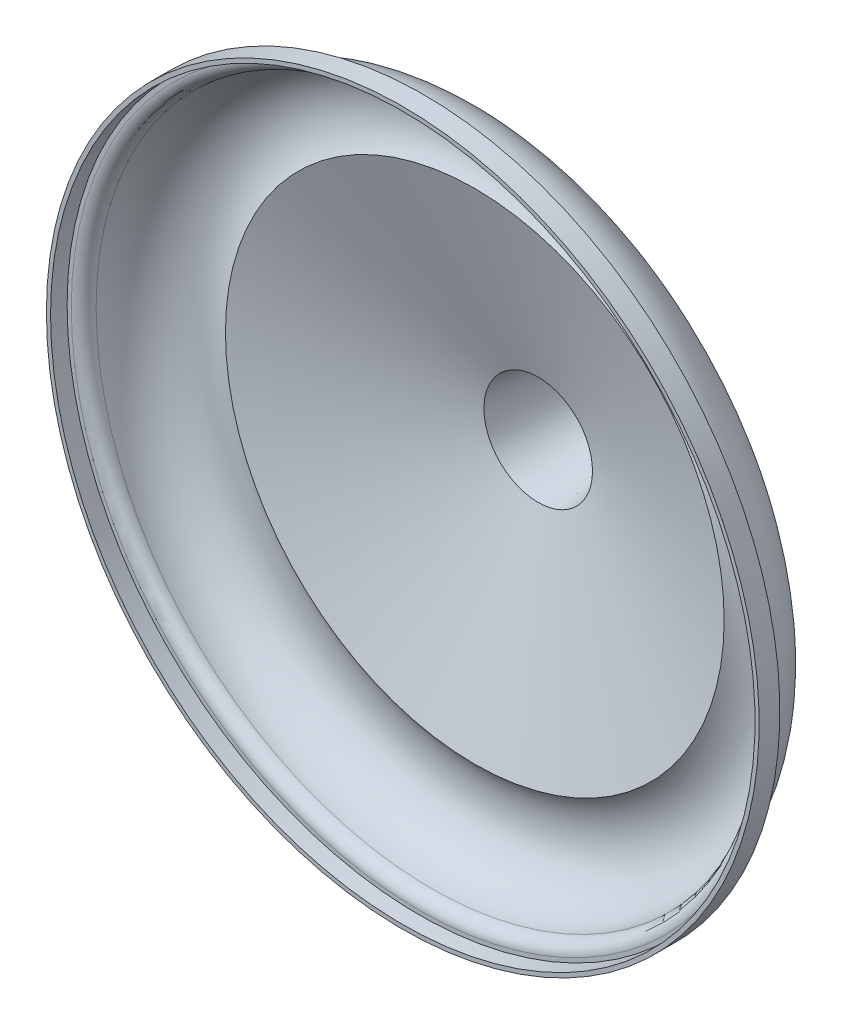
ISO-10303-21;
HEADER;
FILE_DESCRIPTION(('STEP AP214'),'2;1');
FILE_NAME('part.step','',(''),(''),'','','');
FILE_SCHEMA(('AUTOMOTIVE_DESIGN { 1 0 10303 214 1 1 1 1 }'));
ENDSEC;
DATA;
#1=APPLICATION_CONTEXT('core data for automotive mechanical design processes');
#2=APPLICATION_PROTOCOL_DEFINITION('international standard','automotive_design',2000,#1);
#3=PRODUCT_CONTEXT('',#1,'mechanical');
#4=PRODUCT('Part','Part','',(#3));
#5=PRODUCT_RELATED_PRODUCT_CATEGORY('part','',(#4));
#6=PRODUCT_DEFINITION_FORMATION('','',#4);
#7=PRODUCT_DEFINITION_CONTEXT('part definition',#1,'design');
#8=PRODUCT_DEFINITION('design','',#6,#7);
#9=PRODUCT_DEFINITION_SHAPE('','',#8);
#10=(LENGTH_UNIT() NAMED_UNIT(*) SI_UNIT(.MILLI.,.METRE.));
#11=(NAMED_UNIT(*) PLANE_ANGLE_UNIT() SI_UNIT($,.RADIAN.));
#12=(NAMED_UNIT(*) SI_UNIT($,.STERADIAN.) SOLID_ANGLE_UNIT());
#13=UNCERTAINTY_MEASURE_WITH_UNIT(LENGTH_MEASURE(1.E-05),#10,'distance_accuracy_value','');
#14=(GEOMETRIC_REPRESENTATION_CONTEXT(3) GLOBAL_UNCERTAINTY_ASSIGNED_CONTEXT((#13)) GLOBAL_UNIT_ASSIGNED_CONTEXT((#10,
#11,#12)) REPRESENTATION_CONTEXT('',''));
#15=CARTESIAN_POINT('',(0.,0.,0.));
#16=DIRECTION('',(0.,0.,1.));
#17=DIRECTION('',(1.,0.,0.));
#18=AXIS2_PLACEMENT_3D('',#15,#16,#17);
#19=CARTESIAN_POINT('',(43.,0.,0.));
#20=DIRECTION('',(0.,0.,-1.));
#21=DIRECTION('',(-1.,0.,0.));
#22=AXIS2_PLACEMENT_3D('',#19,#20,#21);
#23=PLANE('',#22);
#24=CARTESIAN_POINT('',(0.,0.,0.));
#25=DIRECTION('',(0.,0.,-1.));
#26=DIRECTION('',(-1.,0.,0.));
#27=AXIS2_PLACEMENT_3D('',#24,#25,#26);
#28=CIRCLE('',#27,42.5);
#29=CARTESIAN_POINT('',(-42.5,0.,0.));
#30=VERTEX_POINT('',#29);
#31=EDGE_CURVE('E58',#30,#30,#28,.T.);
#32=ORIENTED_EDGE('',*,*,#31,.T.);
#33=EDGE_LOOP('',(#32));
#34=FACE_BOUND('',#33,.T.);
#35=CARTESIAN_POINT('',(0.,0.,0.));
#36=DIRECTION('',(0.,0.,-1.));
#37=DIRECTION('',(-1.,0.,0.));
#38=AXIS2_PLACEMENT_3D('',#35,#36,#37);
#39=CIRCLE('',#38,43.);
#40=CARTESIAN_POINT('',(-43.,0.,0.));
#41=VERTEX_POINT('',#40);
#42=EDGE_CURVE('E10',#41,#41,#39,.T.);
#43=ORIENTED_EDGE('',*,*,#42,.F.);
#44=EDGE_LOOP('',(#43));
#45=FACE_BOUND('',#44,.T.);
#46=ADVANCED_FACE('F30',(#34,#45),#23,.F.);
#47=CARTESIAN_POINT('',(0.,0.,-30.));
#48=DIRECTION('',(0.,0.,-1.));
#49=DIRECTION('',(-1.,0.,0.));
#50=AXIS2_PLACEMENT_3D('',#47,#48,#49);
#51=CYLINDRICAL_SURFACE('',#50,43.);
#52=CARTESIAN_POINT('',(0.,0.,-2.5));
#53=DIRECTION('',(0.,0.,-1.));
#54=DIRECTION('',(-1.,0.,0.));
#55=AXIS2_PLACEMENT_3D('',#52,#53,#54);
#56=CIRCLE('',#55,43.);
#57=CARTESIAN_POINT('',(-43.,0.,-2.5));
#58=VERTEX_POINT('',#57);
#59=EDGE_CURVE('E36',#58,#58,#56,.T.);
#60=ORIENTED_EDGE('',*,*,#59,.F.);
#61=EDGE_LOOP('',(#60));
#62=FACE_BOUND('',#61,.T.);
#63=ORIENTED_EDGE('',*,*,#42,.T.);
#64=EDGE_LOOP('',(#63));
#65=FACE_BOUND('',#64,.T.);
#66=ADVANCED_FACE('F98',(#62,#65),#51,.T.);
#67=CARTESIAN_POINT('',(43.,0.,-2.5));
#68=DIRECTION('',(0.,0.,1.));
#69=DIRECTION('',(1.,0.,0.));
#70=AXIS2_PLACEMENT_3D('',#67,#68,#69);
#71=PLANE('',#70);
#72=CARTESIAN_POINT('',(0.,0.,-2.50000000000001));
#73=DIRECTION('',(0.,0.,-1.));
#74=DIRECTION('',(-1.,0.,0.));
#75=AXIS2_PLACEMENT_3D('',#72,#73,#74);
#76=CIRCLE('',#75,42.);
#77=CARTESIAN_POINT('',(-42.,0.,-2.50000000000001));
#78=VERTEX_POINT('',#77);
#79=EDGE_CURVE('E40',#78,#78,#76,.T.);
#80=ORIENTED_EDGE('',*,*,#79,.F.);
#81=EDGE_LOOP('',(#80));
#82=FACE_BOUND('',#81,.T.);
#83=ORIENTED_EDGE('',*,*,#59,.T.);
#84=EDGE_LOOP('',(#83));
#85=FACE_BOUND('',#84,.T.);
#86=ADVANCED_FACE('F103',(#82,#85),#71,.F.);
#87=CARTESIAN_POINT('',(0.,0.,-3.5));
#88=DIRECTION('',(0.,0.,-1.));
#89=DIRECTION('',(-1.,0.,0.));
#90=AXIS2_PLACEMENT_3D('',#87,#88,#89);
#91=TOROIDAL_SURFACE('',#90,42.,0.999999999999997);
#92=CARTESIAN_POINT('',(0.,0.,-3.50000000000001));
#93=DIRECTION('',(0.,0.,-1.));
#94=DIRECTION('',(-1.,0.,0.));
#95=AXIS2_PLACEMENT_3D('',#92,#93,#94);
#96=CIRCLE('',#95,41.);
#97=CARTESIAN_POINT('',(-41.,0.,-3.50000000000001));
#98=VERTEX_POINT('',#97);
#99=EDGE_CURVE('E44',#98,#98,#96,.T.);
#100=ORIENTED_EDGE('',*,*,#99,.F.);
#101=EDGE_LOOP('',(#100));
#102=FACE_BOUND('',#101,.T.);
#103=ORIENTED_EDGE('',*,*,#79,.T.);
#104=EDGE_LOOP('',(#103));
#105=FACE_BOUND('',#104,.T.);
#106=ADVANCED_FACE('F110',(#102,#105),#91,.F.);
#107=CARTESIAN_POINT('',(0.,0.,-3.5));
#108=DIRECTION('',(0.,0.,-1.));
#109=DIRECTION('',(-1.,0.,0.));
#110=AXIS2_PLACEMENT_3D('',#107,#108,#109);
#111=TOROIDAL_SURFACE('',#110,34.,7.);
#112=CARTESIAN_POINT('',(0.,0.,-9.244562646538));
#113=DIRECTION('',(0.,0.,-1.));
#114=DIRECTION('',(-1.,0.,0.));
#115=AXIS2_PLACEMENT_3D('',#112,#113,#114);
#116=CIRCLE('',#115,30.);
#117=CARTESIAN_POINT('',(30.,0.,-9.244562646538));
#118=VERTEX_POINT('',#117);
#119=EDGE_CURVE('E49',#118,#118,#116,.T.);
#120=ORIENTED_EDGE('',*,*,#119,.F.);
#121=EDGE_LOOP('',(#120));
#122=FACE_BOUND('',#121,.T.);
#123=ORIENTED_EDGE('',*,*,#99,.T.);
#124=EDGE_LOOP('',(#123));
#125=FACE_BOUND('',#124,.T.);
#126=ADVANCED_FACE('F116',(#122,#125),#111,.T.);
#127=CARTESIAN_POINT('',(0.,0.,-9.244562646538));
#128=DIRECTION('',(0.,0.,1.));
#129=DIRECTION('',(1.,0.,0.));
#130=AXIS2_PLACEMENT_3D('',#127,#128,#129);
#131=CONICAL_SURFACE('',#130,30.,1.25663706143592);
#132=CARTESIAN_POINT('',(0.,0.,-16.7177156598947));
#133=DIRECTION('',(0.,0.,-1.));
#134=DIRECTION('',(-1.,0.,0.));
#135=AXIS2_PLACEMENT_3D('',#132,#133,#134);
#136=CIRCLE('',#135,6.99999999999992);
#137=CARTESIAN_POINT('',(6.99999999999993,0.,-16.7177156598947));
#138=VERTEX_POINT('',#137);
#139=EDGE_CURVE('E52',#138,#138,#136,.T.);
#140=CARTESIAN_POINT('',(6.99999999999993,0.,-16.7177156598947));
#141=CARTESIAN_POINT('',(7.23958333333326,0.,-16.6398703160056));
#142=CARTESIAN_POINT('',(7.47916666666659,0.,-16.5620249721164));
#143=CARTESIAN_POINT('',(7.95833333333326,0.,-16.4063342843382));
#144=CARTESIAN_POINT('',(8.1979166666666,0.,-16.328488940449));
#145=CARTESIAN_POINT('',(8.67708333333326,0.,-16.1727982526708));
#146=CARTESIAN_POINT('',(8.9166666666666,0.,-16.0949529087817));
#147=CARTESIAN_POINT('',(9.39583333333327,0.,-15.9392622210034));
#148=CARTESIAN_POINT('',(9.6354166666666,0.,-15.8614168771143));
#149=CARTESIAN_POINT('',(10.1145833333333,0.,-15.705726189336));
#150=CARTESIAN_POINT('',(10.3541666666666,0.,-15.6278808454469));
#151=CARTESIAN_POINT('',(10.8333333333333,0.,-15.4721901576686));
#152=CARTESIAN_POINT('',(11.0729166666666,0.,-15.3943448137795));
#153=CARTESIAN_POINT('',(11.5520833333333,0.,-15.2386541260012));
#154=CARTESIAN_POINT('',(11.7916666666666,0.,-15.1608087821121));
#155=CARTESIAN_POINT('',(12.2708333333333,0.,-15.0051180943338));
#156=CARTESIAN_POINT('',(12.5104166666666,0.,-14.9272727504447));
#157=CARTESIAN_POINT('',(12.9895833333333,0.,-14.7715820626664));
#158=CARTESIAN_POINT('',(13.2291666666666,0.,-14.6937367187773));
#159=CARTESIAN_POINT('',(13.7083333333333,0.,-14.538046030999));
#160=CARTESIAN_POINT('',(13.9479166666666,0.,-14.4602006871099));
#161=CARTESIAN_POINT('',(14.4270833333333,0.,-14.3045099993316));
#162=CARTESIAN_POINT('',(14.6666666666666,0.,-14.2266646554425));
#163=CARTESIAN_POINT('',(15.1458333333333,0.,-14.0709739676642));
#164=CARTESIAN_POINT('',(15.3854166666666,0.,-13.9931286237751));
#165=CARTESIAN_POINT('',(15.8645833333333,0.,-13.8374379359968));
#166=CARTESIAN_POINT('',(16.1041666666666,0.,-13.7595925921077));
#167=CARTESIAN_POINT('',(16.5833333333333,0.,-13.6039019043294));
#168=CARTESIAN_POINT('',(16.8229166666666,0.,-13.5260565604403));
#169=CARTESIAN_POINT('',(17.3020833333333,0.,-13.370365872662));
#170=CARTESIAN_POINT('',(17.5416666666666,0.,-13.2925205287729));
#171=CARTESIAN_POINT('',(18.0208333333333,0.,-13.1368298409946));
#172=CARTESIAN_POINT('',(18.2604166666666,0.,-13.0589844971055));
#173=CARTESIAN_POINT('',(18.7395833333333,0.,-12.9032938093272));
#174=CARTESIAN_POINT('',(18.9791666666666,0.,-12.8254484654381));
#175=CARTESIAN_POINT('',(19.4583333333333,0.,-12.6697577776598));
#176=CARTESIAN_POINT('',(19.6979166666666,0.,-12.5919124337707));
#177=CARTESIAN_POINT('',(20.1770833333333,0.,-12.4362217459924));
#178=CARTESIAN_POINT('',(20.4166666666666,0.,-12.3583764021033));
#179=CARTESIAN_POINT('',(20.8958333333333,0.,-12.202685714325));
#180=CARTESIAN_POINT('',(21.1354166666666,0.,-12.1248403704359));
#181=CARTESIAN_POINT('',(21.6145833333333,0.,-11.9691496826576));
#182=CARTESIAN_POINT('',(21.8541666666666,0.,-11.8913043387685));
#183=CARTESIAN_POINT('',(22.3333333333333,0.,-11.7356136509902));
#184=CARTESIAN_POINT('',(22.5729166666666,0.,-11.6577683071011));
#185=CARTESIAN_POINT('',(23.0520833333333,0.,-11.5020776193228));
#186=CARTESIAN_POINT('',(23.2916666666666,0.,-11.4242322754337));
#187=CARTESIAN_POINT('',(23.7708333333333,0.,-11.2685415876554));
#188=CARTESIAN_POINT('',(24.0104166666666,0.,-11.1906962437663));
#189=CARTESIAN_POINT('',(24.4895833333333,0.,-11.035005555988));
#190=CARTESIAN_POINT('',(24.7291666666667,0.,-10.9571602120989));
#191=CARTESIAN_POINT('',(25.2083333333333,0.,-10.8014695243206));
#192=CARTESIAN_POINT('',(25.4479166666667,0.,-10.7236241804315));
#193=CARTESIAN_POINT('',(25.9270833333333,0.,-10.5679334926532));
#194=CARTESIAN_POINT('',(26.1666666666667,0.,-10.4900881487641));
#195=CARTESIAN_POINT('',(26.6458333333333,0.,-10.3343974609859));
#196=CARTESIAN_POINT('',(26.8854166666667,0.,-10.2565521170967));
#197=CARTESIAN_POINT('',(27.3645833333333,0.,-10.1008614293185));
#198=CARTESIAN_POINT('',(27.6041666666667,0.,-10.0230160854293));
#199=CARTESIAN_POINT('',(28.0833333333333,0.,-9.86732539765106));
#200=CARTESIAN_POINT('',(28.3229166666667,0.,-9.78948005376193));
#201=CARTESIAN_POINT('',(28.8020833333333,0.,-9.63378936598366));
#202=CARTESIAN_POINT('',(29.0416666666667,0.,-9.55594402209453));
#203=CARTESIAN_POINT('',(29.5208333333333,0.,-9.40025333431627));
#204=CARTESIAN_POINT('',(29.7604166666667,0.,-9.32240799042713));
#205=CARTESIAN_POINT('',(30.,0.,-9.244562646538));
#206=B_SPLINE_CURVE_WITH_KNOTS('',3,(#140,#141,#142,#143,#144,#145,#146,#147,#148,#149,#150,
#151,#152,#153,#154,#155,#156,#157,#158,#159,#160,#161,#162,#163,#164,#165,#166,#167,#168,#169,
#170,#171,#172,#173,#174,#175,#176,#177,#178,#179,#180,#181,#182,#183,#184,#185,#186,#187,#188,
#189,#190,#191,#192,#193,#194,#195,#196,#197,#198,#199,#200,#201,#202,#203,#204,#205),
.UNSPECIFIED.,.F.,.F.,(4,2,2,2,2,2,2,2,2,2,2,2,2,2,2,2,2,2,2,2,2,2,2,2,2,2,2,2,2,2,2,2,4),(0.,
0.755738473671254,1.51147694734251,2.26721542101376,3.02295389468502,3.77869236835628,
4.53443084202753,5.29016931569879,6.04590778937004,6.8016462630413,7.55738473671255,
8.31312321038381,9.06886168405506,9.82460015772632,10.5803386313976,11.3360771050688,
12.0918155787401,12.8475540524113,13.6032925260826,14.3590309997539,15.1147694734251,
15.8705079470964,16.6262464207676,17.3819848944389,18.1377233681101,18.8934618417814,
19.6492003154526,20.4049387891239,21.1606772627952,21.9164157364664,22.6721542101377,
23.4278926838089,24.1836311574802),.UNSPECIFIED.);
#207=EDGE_CURVE('BSEAM120',#138,#118,#206,.T.);
#208=ORIENTED_EDGE('',*,*,#139,.F.);
#209=ORIENTED_EDGE('',*,*,#119,.T.);
#210=ORIENTED_EDGE('',*,*,#207,.T.);
#211=ORIENTED_EDGE('',*,*,#207,.F.);
#212=EDGE_LOOP('',(#208,#210,#209,#211));
#213=FACE_BOUND('',#212,.T.);
#214=ADVANCED_FACE('F120',(#213),#131,.T.);
#215=CARTESIAN_POINT('',(0.,0.,-16.7177156598947));
#216=DIRECTION('',(0.,0.,1.));
#217=DIRECTION('',(1.,0.,0.));
#218=AXIS2_PLACEMENT_3D('',#215,#216,#217);
#219=CONICAL_SURFACE('',#218,6.99999999999992,0.14569427150286);
#220=CARTESIAN_POINT('',(0.,0.,-29.3255659684264));
#221=DIRECTION('',(0.,0.,-1.));
#222=DIRECTION('',(-1.,0.,0.));
#223=AXIS2_PLACEMENT_3D('',#220,#221,#222);
#224=CIRCLE('',#223,5.15);
#225=CARTESIAN_POINT('',(-5.15,0.,-29.3255659684264));
#226=VERTEX_POINT('',#225);
#227=EDGE_CURVE('E55',#226,#226,#224,.T.);
#228=ORIENTED_EDGE('',*,*,#227,.F.);
#229=EDGE_LOOP('',(#228));
#230=FACE_BOUND('',#229,.T.);
#231=ORIENTED_EDGE('',*,*,#139,.T.);
#232=EDGE_LOOP('',(#231));
#233=FACE_BOUND('',#232,.T.);
#234=ADVANCED_FACE('F124',(#230,#233),#219,.T.);
#235=CARTESIAN_POINT('',(0.,0.,-10.));
#236=DIRECTION('',(0.,0.,-1.));
#237=DIRECTION('',(1.,0.,0.));
#238=AXIS2_PLACEMENT_3D('',#235,#236,#237);
#239=SPHERICAL_SURFACE('',#238,20.);
#240=ORIENTED_EDGE('',*,*,#227,.T.);
#241=EDGE_LOOP('',(#240));
#242=FACE_BOUND('',#241,.T.);
#243=ADVANCED_FACE('F95',(#242),#239,.T.);
#244=CARTESIAN_POINT('',(0.,0.,-30.));
#245=DIRECTION('',(0.,0.,-1.));
#246=DIRECTION('',(-1.,0.,0.));
#247=AXIS2_PLACEMENT_3D('',#244,#245,#246);
#248=CYLINDRICAL_SURFACE('',#247,42.5);
#249=CARTESIAN_POINT('',(0.,0.,-2.00000000000001));
#250=DIRECTION('',(0.,0.,1.));
#251=DIRECTION('',(1.,0.,0.));
#252=AXIS2_PLACEMENT_3D('',#249,#250,#251);
#253=CIRCLE('',#252,42.5);
#254=CARTESIAN_POINT('',(42.5,0.,-2.00000000000001));
#255=VERTEX_POINT('',#254);
#256=EDGE_CURVE('E61',#255,#255,#253,.F.);
#257=ORIENTED_EDGE('',*,*,#256,.T.);
#258=EDGE_LOOP('',(#257));
#259=FACE_BOUND('',#258,.T.);
#260=ORIENTED_EDGE('',*,*,#31,.F.);
#261=EDGE_LOOP('',(#260));
#262=FACE_BOUND('',#261,.T.);
#263=ADVANCED_FACE('F80',(#259,#262),#248,.F.);
#264=CARTESIAN_POINT('',(43.,0.,-2.));
#265=DIRECTION('',(0.,0.,1.));
#266=DIRECTION('',(1.,0.,0.));
#267=AXIS2_PLACEMENT_3D('',#264,#265,#266);
#268=PLANE('',#267);
#269=CARTESIAN_POINT('',(0.,0.,-2.00000000000001));
#270=DIRECTION('',(0.,0.,-1.));
#271=DIRECTION('',(-1.,0.,0.));
#272=AXIS2_PLACEMENT_3D('',#269,#270,#271);
#273=CIRCLE('',#272,42.);
#274=CARTESIAN_POINT('',(-42.,0.,-2.00000000000001));
#275=VERTEX_POINT('',#274);
#276=EDGE_CURVE('E74',#275,#275,#273,.T.);
#277=ORIENTED_EDGE('',*,*,#276,.T.);
#278=EDGE_LOOP('',(#277));
#279=FACE_BOUND('',#278,.T.);
#280=ORIENTED_EDGE('',*,*,#256,.F.);
#281=EDGE_LOOP('',(#280));
#282=FACE_BOUND('',#281,.T.);
#283=ADVANCED_FACE('F83',(#279,#282),#268,.T.);
#284=CARTESIAN_POINT('',(0.,0.,-3.5));
#285=DIRECTION('',(0.,0.,-1.));
#286=DIRECTION('',(-1.,0.,0.));
#287=AXIS2_PLACEMENT_3D('',#284,#285,#286);
#288=TOROIDAL_SURFACE('',#287,42.,1.5);
#289=CARTESIAN_POINT('',(0.,0.,-3.50000000000001));
#290=DIRECTION('',(0.,0.,-1.));
#291=DIRECTION('',(-1.,0.,0.));
#292=AXIS2_PLACEMENT_3D('',#289,#290,#291);
#293=CIRCLE('',#292,40.5);
#294=CARTESIAN_POINT('',(-40.5,0.,-3.50000000000001));
#295=VERTEX_POINT('',#294);
#296=EDGE_CURVE('E71',#295,#295,#293,.T.);
#297=ORIENTED_EDGE('',*,*,#296,.T.);
#298=EDGE_LOOP('',(#297));
#299=FACE_BOUND('',#298,.T.);
#300=ORIENTED_EDGE('',*,*,#276,.F.);
#301=EDGE_LOOP('',(#300));
#302=FACE_BOUND('',#301,.T.);
#303=ADVANCED_FACE('F85',(#299,#302),#288,.T.);
#304=CARTESIAN_POINT('',(0.,0.,-3.5));
#305=DIRECTION('',(0.,0.,-1.));
#306=DIRECTION('',(-1.,0.,0.));
#307=AXIS2_PLACEMENT_3D('',#304,#305,#306);
#308=TOROIDAL_SURFACE('',#307,34.,6.5);
#309=CARTESIAN_POINT('',(0.,0.,-8.6904614300036));
#310=DIRECTION('',(0.,0.,1.));
#311=DIRECTION('',(1.,0.,0.));
#312=AXIS2_PLACEMENT_3D('',#309,#310,#311);
#313=CIRCLE('',#312,30.0873142033068);
#314=CARTESIAN_POINT('',(30.0873142033068,0.,-8.6904614300036));
#315=VERTEX_POINT('',#314);
#316=EDGE_CURVE('E68',#315,#315,#313,.F.);
#317=ORIENTED_EDGE('',*,*,#316,.T.);
#318=EDGE_LOOP('',(#317));
#319=FACE_BOUND('',#318,.T.);
#320=ORIENTED_EDGE('',*,*,#296,.F.);
#321=EDGE_LOOP('',(#320));
#322=FACE_BOUND('',#321,.T.);
#323=ADVANCED_FACE('F92',(#319,#322),#308,.F.);
#324=CARTESIAN_POINT('',(0.,0.,-8.76903438839042));
#325=DIRECTION('',(0.,0.,1.));
#326=DIRECTION('',(1.,0.,0.));
#327=AXIS2_PLACEMENT_3D('',#324,#325,#326);
#328=CONICAL_SURFACE('',#327,29.8454915028125,1.25663706143592);
#329=CARTESIAN_POINT('',(0.,0.,-16.3380844460755));
#330=DIRECTION('',(0.,0.,-1.));
#331=DIRECTION('',(-1.,0.,0.));
#332=AXIS2_PLACEMENT_3D('',#329,#330,#331);
#333=CIRCLE('',#332,6.55035074821912);
#334=CARTESIAN_POINT('',(6.55035074821912,0.,-16.3380844460755));
#335=VERTEX_POINT('',#334);
#336=EDGE_CURVE('E65',#335,#335,#333,.T.);
#337=CARTESIAN_POINT('',(6.55035074821912,0.,-16.3380844460755));
#338=CARTESIAN_POINT('',(6.79552745087628,0.,-16.2584217063248));
#339=CARTESIAN_POINT('',(7.04070415353345,0.,-16.178758966574));
#340=CARTESIAN_POINT('',(7.53105755884777,0.,-16.0194334870725));
#341=CARTESIAN_POINT('',(7.77623426150494,0.,-15.9397707473218));
#342=CARTESIAN_POINT('',(8.26658766681926,0.,-15.7804452678203));
#343=CARTESIAN_POINT('',(8.51176436947643,0.,-15.7007825280695));
#344=CARTESIAN_POINT('',(9.00211777479075,0.,-15.5414570485681));
#345=CARTESIAN_POINT('',(9.24729447744792,0.,-15.4617943088173));
#346=CARTESIAN_POINT('',(9.73764788276225,0.,-15.3024688293158));
#347=CARTESIAN_POINT('',(9.98282458541941,0.,-15.2228060895651));
#348=CARTESIAN_POINT('',(10.4731779907337,0.,-15.0634806100636));
#349=CARTESIAN_POINT('',(10.7183546933909,0.,-14.9838178703128));
#350=CARTESIAN_POINT('',(11.2087080987052,0.,-14.8244923908113));
#351=CARTESIAN_POINT('',(11.4538848013624,0.,-14.7448296510606));
#352=CARTESIAN_POINT('',(11.9442382066767,0.,-14.5855041715591));
#353=CARTESIAN_POINT('',(12.1894149093339,0.,-14.5058414318083));
#354=CARTESIAN_POINT('',(12.6797683146482,0.,-14.3465159523068));
#355=CARTESIAN_POINT('',(12.9249450173054,0.,-14.2668532125561));
#356=CARTESIAN_POINT('',(13.4152984226197,0.,-14.1075277330546));
#357=CARTESIAN_POINT('',(13.6604751252769,0.,-14.0278649933038));
#358=CARTESIAN_POINT('',(14.1508285305912,0.,-13.8685395138023));
#359=CARTESIAN_POINT('',(14.3960052332483,0.,-13.7888767740516));
#360=CARTESIAN_POINT('',(14.8863586385627,0.,-13.6295512945501));
#361=CARTESIAN_POINT('',(15.1315353412198,0.,-13.5498885547993));
#362=CARTESIAN_POINT('',(15.6218887465342,0.,-13.3905630752978));
#363=CARTESIAN_POINT('',(15.8670654491913,0.,-13.3109003355471));
#364=CARTESIAN_POINT('',(16.3574188545057,0.,-13.1515748560456));
#365=CARTESIAN_POINT('',(16.6025955571628,0.,-13.0719121162948));
#366=CARTESIAN_POINT('',(17.0929489624771,0.,-12.9125866367933));
#367=CARTESIAN_POINT('',(17.3381256651343,0.,-12.8329238970426));
#368=CARTESIAN_POINT('',(17.8284790704486,0.,-12.6735984175411));
#369=CARTESIAN_POINT('',(18.0736557731058,0.,-12.5939356777903));
#370=CARTESIAN_POINT('',(18.5640091784201,0.,-12.4346101982888));
#371=CARTESIAN_POINT('',(18.8091858810773,0.,-12.3549474585381));
#372=CARTESIAN_POINT('',(19.2995392863916,0.,-12.1956219790366));
#373=CARTESIAN_POINT('',(19.5447159890488,0.,-12.1159592392858));
#374=CARTESIAN_POINT('',(20.0350693943631,0.,-11.9566337597843));
#375=CARTESIAN_POINT('',(20.2802460970203,0.,-11.8769710200336));
#376=CARTESIAN_POINT('',(20.7705995023346,0.,-11.7176455405321));
#377=CARTESIAN_POINT('',(21.0157762049918,0.,-11.6379828007813));
#378=CARTESIAN_POINT('',(21.5061296103061,0.,-11.4786573212798));
#379=CARTESIAN_POINT('',(21.7513063129633,0.,-11.3989945815291));
#380=CARTESIAN_POINT('',(22.2416597182776,0.,-11.2396691020276));
#381=CARTESIAN_POINT('',(22.4868364209347,0.,-11.1600063622768));
#382=CARTESIAN_POINT('',(22.9771898262491,0.,-11.0006808827753));
#383=CARTESIAN_POINT('',(23.2223665289062,0.,-10.9210181430246));
#384=CARTESIAN_POINT('',(23.7127199342206,0.,-10.7616926635231));
#385=CARTESIAN_POINT('',(23.9578966368777,0.,-10.6820299237723));
#386=CARTESIAN_POINT('',(24.4482500421921,0.,-10.5227044442708));
#387=CARTESIAN_POINT('',(24.6934267448492,0.,-10.4430417045201));
#388=CARTESIAN_POINT('',(25.1837801501635,0.,-10.2837162250186));
#389=CARTESIAN_POINT('',(25.4289568528207,0.,-10.2040534852678));
#390=CARTESIAN_POINT('',(25.919310258135,0.,-10.0447280057663));
#391=CARTESIAN_POINT('',(26.1644869607922,0.,-9.96506526601559));
#392=CARTESIAN_POINT('',(26.6548403661065,0.,-9.80573978651409));
#393=CARTESIAN_POINT('',(26.9000170687637,0.,-9.72607704676335));
#394=CARTESIAN_POINT('',(27.390370474078,0.,-9.56675156726184));
#395=CARTESIAN_POINT('',(27.6355471767352,0.,-9.4870888275111));
#396=CARTESIAN_POINT('',(28.1259005820495,0.,-9.3277633480096));
#397=CARTESIAN_POINT('',(28.3710772847067,0.,-9.24810060825885));
#398=CARTESIAN_POINT('',(28.861430690021,0.,-9.08877512875735));
#399=CARTESIAN_POINT('',(29.1066073926782,0.,-9.0091123890066));
#400=CARTESIAN_POINT('',(29.5969607979925,0.,-8.8497869095051));
#401=CARTESIAN_POINT('',(29.8421375006496,0.,-8.77012416975435));
#402=CARTESIAN_POINT('',(30.0873142033068,0.,-8.6904614300036));
#403=B_SPLINE_CURVE_WITH_KNOTS('',3,(#337,#338,#339,#340,#341,#342,#343,#344,#345,#346,#347,
#348,#349,#350,#351,#352,#353,#354,#355,#356,#357,#358,#359,#360,#361,#362,#363,#364,#365,#366,
#367,#368,#369,#370,#371,#372,#373,#374,#375,#376,#377,#378,#379,#380,#381,#382,#383,#384,#385,
#386,#387,#388,#389,#390,#391,#392,#393,#394,#395,#396,#397,#398,#399,#400,#401,#402),
.UNSPECIFIED.,.F.,.F.,(4,2,2,2,2,2,2,2,2,2,2,2,2,2,2,2,2,2,2,2,2,2,2,2,2,2,2,2,2,2,2,2,4),(0.,
0.773382123321913,1.54676424664383,2.32014636996574,3.09352849328766,3.86691061660957,
4.64029273993148,5.4136748632534,6.18705698657531,6.96043910989723,7.73382123321914,
8.50720335654106,9.28058547986297,10.0539676031849,10.8273497265068,11.6007318498287,
12.3741139731506,13.1474960964725,13.9208782197945,14.6942603431164,15.4676424664383,
16.2410245897602,17.0144067130821,17.787788836404,18.5611709597259,19.3345530830479,
20.1079352063698,20.8813173296917,21.6546994530136,22.4280815763355,23.2014636996574,
23.9748458229793,24.7482279463012),.UNSPECIFIED.);
#404=EDGE_CURVE('BSEAM139',#335,#315,#403,.T.);
#405=ORIENTED_EDGE('',*,*,#336,.T.);
#406=ORIENTED_EDGE('',*,*,#316,.F.);
#407=ORIENTED_EDGE('',*,*,#404,.T.);
#408=ORIENTED_EDGE('',*,*,#404,.F.);
#409=EDGE_LOOP('',(#405,#407,#406,#408));
#410=FACE_BOUND('',#409,.T.);
#411=ADVANCED_FACE('F139',(#410),#328,.F.);
#412=CARTESIAN_POINT('',(0.,0.,-16.6451259696027));
#413=DIRECTION('',(0.,0.,1.));
#414=DIRECTION('',(1.,0.,0.));
#415=AXIS2_PLACEMENT_3D('',#412,#413,#414);
#416=CONICAL_SURFACE('',#415,6.50529732478651,0.14569427150286);
#417=CARTESIAN_POINT('',(0.,0.,-28.9242374590932));
#418=DIRECTION('',(0.,0.,1.));
#419=DIRECTION('',(1.,0.,0.));
#420=AXIS2_PLACEMENT_3D('',#417,#418,#419);
#421=CIRCLE('',#420,4.70353447865053);
#422=CARTESIAN_POINT('',(4.70353447865053,0.,-28.9242374590932));
#423=VERTEX_POINT('',#422);
#424=EDGE_CURVE('E62',#423,#423,#421,.F.);
#425=ORIENTED_EDGE('',*,*,#424,.T.);
#426=EDGE_LOOP('',(#425));
#427=FACE_BOUND('',#426,.T.);
#428=ORIENTED_EDGE('',*,*,#336,.F.);
#429=EDGE_LOOP('',(#428));
#430=FACE_BOUND('',#429,.T.);
#431=ADVANCED_FACE('F135',(#427,#430),#416,.F.);
#432=CARTESIAN_POINT('',(0.,0.,-10.));
#433=DIRECTION('',(0.,0.,-1.));
#434=DIRECTION('',(1.,0.,0.));
#435=AXIS2_PLACEMENT_3D('',#432,#433,#434);
#436=SPHERICAL_SURFACE('',#435,19.5);
#437=ORIENTED_EDGE('',*,*,#424,.F.);
#438=EDGE_LOOP('',(#437));
#439=FACE_BOUND('',#438,.T.);
#440=ADVANCED_FACE('F132',(#439),#436,.F.);
#441=CLOSED_SHELL('',(#46,#66,#86,#106,#126,#214,#234,#243,#263,#283,#303,#323,#411,#431,#440));
#442=MANIFOLD_SOLID_BREP('B2',#441);
#443=ADVANCED_BREP_SHAPE_REPRESENTATION('',(#18,#442),#14);
#444=SHAPE_DEFINITION_REPRESENTATION(#9,#443);
ENDSEC;
END-ISO-10303-21;
